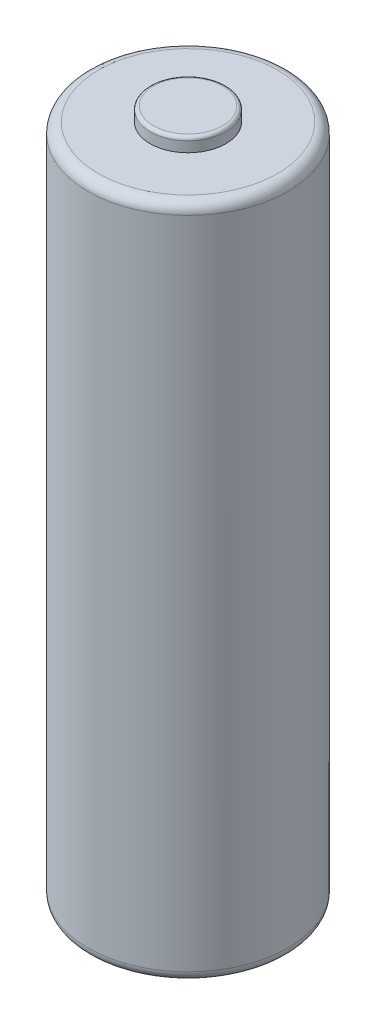
ISO-10303-21;
HEADER;
FILE_DESCRIPTION(('STEP AP214'),'2;1');
FILE_NAME('part.step','',(''),(''),'','','');
FILE_SCHEMA(('AUTOMOTIVE_DESIGN { 1 0 10303 214 1 1 1 1 }'));
ENDSEC;
DATA;
#1=APPLICATION_CONTEXT('core data for automotive mechanical design processes');
#2=APPLICATION_PROTOCOL_DEFINITION('international standard','automotive_design',2000,#1);
#3=PRODUCT_CONTEXT('',#1,'mechanical');
#4=PRODUCT('Part','Part','',(#3));
#5=PRODUCT_RELATED_PRODUCT_CATEGORY('part','',(#4));
#6=PRODUCT_DEFINITION_FORMATION('','',#4);
#7=PRODUCT_DEFINITION_CONTEXT('part definition',#1,'design');
#8=PRODUCT_DEFINITION('design','',#6,#7);
#9=PRODUCT_DEFINITION_SHAPE('','',#8);
#10=(LENGTH_UNIT() NAMED_UNIT(*) SI_UNIT(.MILLI.,.METRE.));
#11=(NAMED_UNIT(*) PLANE_ANGLE_UNIT() SI_UNIT($,.RADIAN.));
#12=(NAMED_UNIT(*) SI_UNIT($,.STERADIAN.) SOLID_ANGLE_UNIT());
#13=UNCERTAINTY_MEASURE_WITH_UNIT(LENGTH_MEASURE(1.E-05),#10,'distance_accuracy_value','');
#14=(GEOMETRIC_REPRESENTATION_CONTEXT(3) GLOBAL_UNCERTAINTY_ASSIGNED_CONTEXT((#13)) GLOBAL_UNIT_ASSIGNED_CONTEXT((#10,
#11,#12)) REPRESENTATION_CONTEXT('',''));
#15=CARTESIAN_POINT('',(0.,0.,0.));
#16=DIRECTION('',(0.,0.,1.));
#17=DIRECTION('',(1.,0.,0.));
#18=AXIS2_PLACEMENT_3D('',#15,#16,#17);
#19=CARTESIAN_POINT('',(0.,0.,0.));
#20=DIRECTION('',(0.,1.,0.));
#21=DIRECTION('',(0.,0.,1.));
#22=AXIS2_PLACEMENT_3D('',#19,#20,#21);
#23=PLANE('',#22);
#24=CARTESIAN_POINT('',(0.,0.,0.));
#25=DIRECTION('',(0.,1.,0.));
#26=DIRECTION('',(0.,0.,1.));
#27=AXIS2_PLACEMENT_3D('',#24,#25,#26);
#28=CIRCLE('',#27,6.5);
#29=CARTESIAN_POINT('',(0.,0.,6.5));
#30=VERTEX_POINT('',#29);
#31=EDGE_CURVE('E55',#30,#30,#28,.T.);
#32=ORIENTED_EDGE('',*,*,#31,.T.);
#33=EDGE_LOOP('',(#32));
#34=FACE_BOUND('',#33,.T.);
#35=CARTESIAN_POINT('',(0.,0.,0.));
#36=DIRECTION('',(0.,-1.,0.));
#37=DIRECTION('',(0.,0.,-1.));
#38=AXIS2_PLACEMENT_3D('',#35,#36,#37);
#39=CIRCLE('',#38,2.75);
#40=CARTESIAN_POINT('',(0.,0.,-2.75));
#41=VERTEX_POINT('',#40);
#42=EDGE_CURVE('E64',#41,#41,#39,.T.);
#43=ORIENTED_EDGE('',*,*,#42,.T.);
#44=EDGE_LOOP('',(#43));
#45=FACE_BOUND('',#44,.T.);
#46=ADVANCED_FACE('F32',(#34,#45),#23,.T.);
#47=CARTESIAN_POINT('',(0.,0.,0.));
#48=DIRECTION('',(0.,1.,0.));
#49=DIRECTION('',(0.,0.,1.));
#50=AXIS2_PLACEMENT_3D('',#47,#48,#49);
#51=CYLINDRICAL_SURFACE('',#50,7.25);
#52=CARTESIAN_POINT('',(0.,-0.75,0.));
#53=DIRECTION('',(0.,1.,0.));
#54=DIRECTION('',(0.,0.,1.));
#55=AXIS2_PLACEMENT_3D('',#52,#53,#54);
#56=CIRCLE('',#55,7.25);
#57=CARTESIAN_POINT('',(0.,-0.75,7.25));
#58=VERTEX_POINT('',#57);
#59=EDGE_CURVE('E47',#58,#58,#56,.F.);
#60=ORIENTED_EDGE('',*,*,#59,.T.);
#61=EDGE_LOOP('',(#60));
#62=FACE_BOUND('',#61,.T.);
#63=CARTESIAN_POINT('',(0.,-48.25,0.));
#64=DIRECTION('',(0.,-1.,0.));
#65=DIRECTION('',(0.,0.,-1.));
#66=AXIS2_PLACEMENT_3D('',#63,#64,#65);
#67=CIRCLE('',#66,7.25);
#68=CARTESIAN_POINT('',(0.,-48.25,-7.25));
#69=VERTEX_POINT('',#68);
#70=EDGE_CURVE('E52',#69,#69,#67,.F.);
#71=ORIENTED_EDGE('',*,*,#70,.T.);
#72=EDGE_LOOP('',(#71));
#73=FACE_BOUND('',#72,.T.);
#74=ADVANCED_FACE('F84',(#62,#73),#51,.T.);
#75=CARTESIAN_POINT('',(-6.33564090980885,-49.,0.));
#76=DIRECTION('',(0.,-1.,0.));
#77=DIRECTION('',(0.,0.,-1.));
#78=AXIS2_PLACEMENT_3D('',#75,#76,#77);
#79=PLANE('',#78);
#80=CARTESIAN_POINT('',(0.,-49.,0.));
#81=DIRECTION('',(0.,-1.,0.));
#82=DIRECTION('',(0.,0.,-1.));
#83=AXIS2_PLACEMENT_3D('',#80,#81,#82);
#84=CIRCLE('',#83,6.5);
#85=CARTESIAN_POINT('',(0.,-49.,-6.5));
#86=VERTEX_POINT('',#85);
#87=EDGE_CURVE('E43',#86,#86,#84,.T.);
#88=ORIENTED_EDGE('',*,*,#87,.T.);
#89=EDGE_LOOP('',(#88));
#90=FACE_BOUND('',#89,.T.);
#91=CARTESIAN_POINT('',(0.,-49.,0.));
#92=DIRECTION('',(0.,1.,0.));
#93=DIRECTION('',(0.,0.,1.));
#94=AXIS2_PLACEMENT_3D('',#91,#92,#93);
#95=CIRCLE('',#94,6.33564090980885);
#96=CARTESIAN_POINT('',(0.,-49.,6.33564090980885));
#97=VERTEX_POINT('',#96);
#98=EDGE_CURVE('E58',#97,#97,#95,.T.);
#99=ORIENTED_EDGE('',*,*,#98,.T.);
#100=EDGE_LOOP('',(#99));
#101=FACE_BOUND('',#100,.T.);
#102=ADVANCED_FACE('F90',(#90,#101),#79,.T.);
#103=CARTESIAN_POINT('',(0.,-49.,0.));
#104=DIRECTION('',(0.,1.,0.));
#105=DIRECTION('',(0.,0.,1.));
#106=AXIS2_PLACEMENT_3D('',#103,#104,#105);
#107=CONICAL_SURFACE('',#106,6.33564090980885,1.39626340159546);
#108=CARTESIAN_POINT('',(0.,-49.5,0.));
#109=DIRECTION('',(0.,1.,0.));
#110=DIRECTION('',(0.,0.,1.));
#111=AXIS2_PLACEMENT_3D('',#108,#109,#110);
#112=CIRCLE('',#111,3.49999999999999);
#113=CARTESIAN_POINT('',(0.,-49.5,3.49999999999999));
#114=VERTEX_POINT('',#113);
#115=EDGE_CURVE('E61',#114,#114,#112,.T.);
#116=ORIENTED_EDGE('',*,*,#115,.T.);
#117=EDGE_LOOP('',(#116));
#118=FACE_BOUND('',#117,.T.);
#119=ORIENTED_EDGE('',*,*,#98,.F.);
#120=EDGE_LOOP('',(#119));
#121=FACE_BOUND('',#120,.T.);
#122=ADVANCED_FACE('F107',(#118,#121),#107,.T.);
#123=CARTESIAN_POINT('',(0.,-49.5,0.));
#124=DIRECTION('',(0.,-1.,0.));
#125=DIRECTION('',(0.,0.,-1.));
#126=AXIS2_PLACEMENT_3D('',#123,#124,#125);
#127=PLANE('',#126);
#128=ORIENTED_EDGE('',*,*,#115,.F.);
#129=EDGE_LOOP('',(#128));
#130=FACE_BOUND('',#129,.T.);
#131=ADVANCED_FACE('F81',(#130),#127,.T.);
#132=CARTESIAN_POINT('',(0.,0.999999999999998,0.));
#133=DIRECTION('',(0.,-1.,0.));
#134=DIRECTION('',(0.,0.,-1.));
#135=AXIS2_PLACEMENT_3D('',#132,#133,#134);
#136=PLANE('',#135);
#137=CARTESIAN_POINT('',(0.,0.999999999999998,0.));
#138=DIRECTION('',(0.,-1.,0.));
#139=DIRECTION('',(0.,0.,-1.));
#140=AXIS2_PLACEMENT_3D('',#137,#138,#139);
#141=CIRCLE('',#140,2.5);
#142=CARTESIAN_POINT('',(0.,0.999999999999998,-2.5));
#143=VERTEX_POINT('',#142);
#144=EDGE_CURVE('E10',#143,#143,#141,.F.);
#145=ORIENTED_EDGE('',*,*,#144,.T.);
#146=EDGE_LOOP('',(#145));
#147=FACE_BOUND('',#146,.T.);
#148=ADVANCED_FACE('F72',(#147),#136,.F.);
#149=CARTESIAN_POINT('',(0.,0.,0.));
#150=DIRECTION('',(0.,-1.,0.));
#151=DIRECTION('',(0.,0.,-1.));
#152=AXIS2_PLACEMENT_3D('',#149,#150,#151);
#153=CYLINDRICAL_SURFACE('',#152,2.75);
#154=CARTESIAN_POINT('',(0.,0.749999999999998,0.));
#155=DIRECTION('',(0.,-1.,0.));
#156=DIRECTION('',(0.,0.,-1.));
#157=AXIS2_PLACEMENT_3D('',#154,#155,#156);
#158=CIRCLE('',#157,2.75);
#159=CARTESIAN_POINT('',(0.,0.749999999999998,-2.75));
#160=VERTEX_POINT('',#159);
#161=EDGE_CURVE('E39',#160,#160,#158,.T.);
#162=ORIENTED_EDGE('',*,*,#161,.T.);
#163=EDGE_LOOP('',(#162));
#164=FACE_BOUND('',#163,.T.);
#165=ORIENTED_EDGE('',*,*,#42,.F.);
#166=EDGE_LOOP('',(#165));
#167=FACE_BOUND('',#166,.T.);
#168=ADVANCED_FACE('F69',(#164,#167),#153,.T.);
#169=CARTESIAN_POINT('',(0.,-0.75,0.));
#170=DIRECTION('',(0.,1.,0.));
#171=DIRECTION('',(0.,0.,1.));
#172=AXIS2_PLACEMENT_3D('',#169,#170,#171);
#173=TOROIDAL_SURFACE('',#172,6.5,0.75);
#174=ORIENTED_EDGE('',*,*,#59,.F.);
#175=EDGE_LOOP('',(#174));
#176=FACE_BOUND('',#175,.T.);
#177=ORIENTED_EDGE('',*,*,#31,.F.);
#178=EDGE_LOOP('',(#177));
#179=FACE_BOUND('',#178,.T.);
#180=ADVANCED_FACE('F71',(#176,#179),#173,.T.);
#181=CARTESIAN_POINT('',(0.,-48.25,0.));
#182=DIRECTION('',(0.,-1.,0.));
#183=DIRECTION('',(0.,0.,-1.));
#184=AXIS2_PLACEMENT_3D('',#181,#182,#183);
#185=TOROIDAL_SURFACE('',#184,6.5,0.75);
#186=ORIENTED_EDGE('',*,*,#87,.F.);
#187=EDGE_LOOP('',(#186));
#188=FACE_BOUND('',#187,.T.);
#189=ORIENTED_EDGE('',*,*,#70,.F.);
#190=EDGE_LOOP('',(#189));
#191=FACE_BOUND('',#190,.T.);
#192=ADVANCED_FACE('F78',(#188,#191),#185,.T.);
#193=CARTESIAN_POINT('',(0.,0.749999999999998,0.));
#194=DIRECTION('',(0.,-1.,0.));
#195=DIRECTION('',(0.,0.,-1.));
#196=AXIS2_PLACEMENT_3D('',#193,#194,#195);
#197=TOROIDAL_SURFACE('',#196,2.5,0.25);
#198=ORIENTED_EDGE('',*,*,#144,.F.);
#199=EDGE_LOOP('',(#198));
#200=FACE_BOUND('',#199,.T.);
#201=ORIENTED_EDGE('',*,*,#161,.F.);
#202=EDGE_LOOP('',(#201));
#203=FACE_BOUND('',#202,.T.);
#204=ADVANCED_FACE('F34',(#200,#203),#197,.T.);
#205=CLOSED_SHELL('',(#46,#74,#102,#122,#131,#148,#168,#180,#192,#204));
#206=MANIFOLD_SOLID_BREP('B2',#205);
#207=ADVANCED_BREP_SHAPE_REPRESENTATION('',(#18,#206),#14);
#208=SHAPE_DEFINITION_REPRESENTATION(#9,#207);
ENDSEC;
END-ISO-10303-21;
